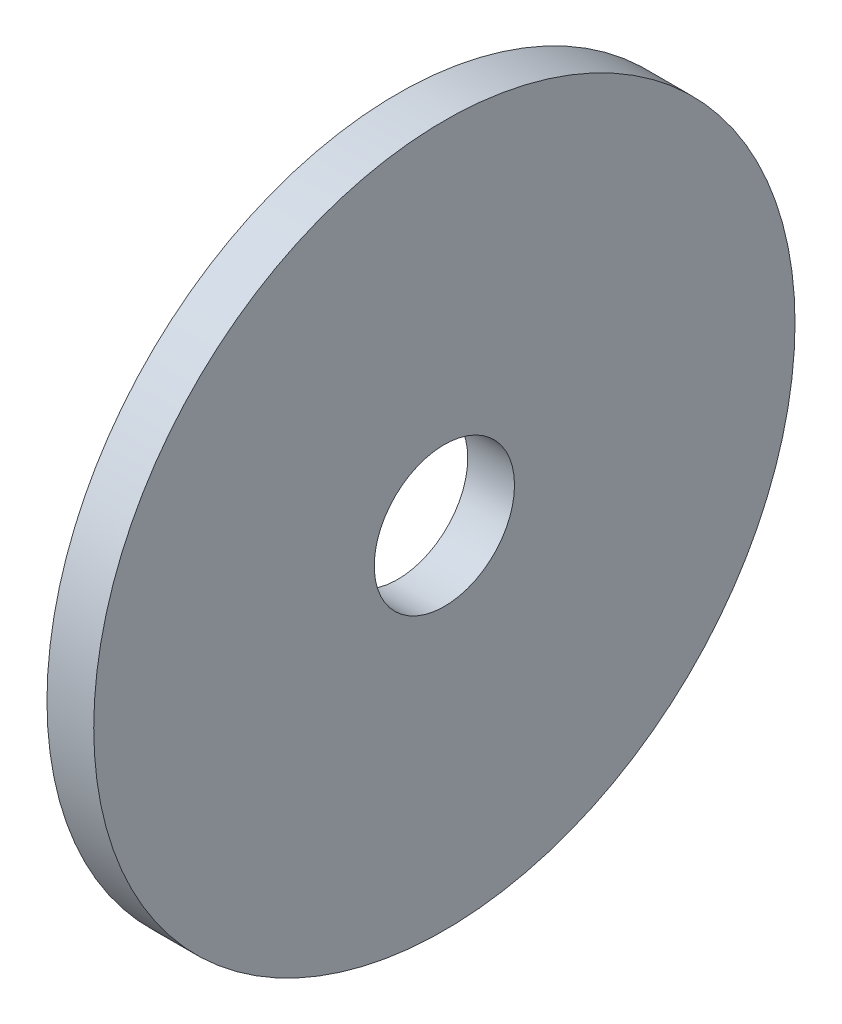
ISO-10303-21;
HEADER;
FILE_DESCRIPTION(('STEP AP214'),'2;1');
FILE_NAME('part.step','',(''),(''),'','','');
FILE_SCHEMA(('AUTOMOTIVE_DESIGN { 1 0 10303 214 1 1 1 1 }'));
ENDSEC;
DATA;
#1=APPLICATION_CONTEXT('core data for automotive mechanical design processes');
#2=APPLICATION_PROTOCOL_DEFINITION('international standard','automotive_design',2000,#1);
#3=PRODUCT_CONTEXT('',#1,'mechanical');
#4=PRODUCT('Part','Part','',(#3));
#5=PRODUCT_RELATED_PRODUCT_CATEGORY('part','',(#4));
#6=PRODUCT_DEFINITION_FORMATION('','',#4);
#7=PRODUCT_DEFINITION_CONTEXT('part definition',#1,'design');
#8=PRODUCT_DEFINITION('design','',#6,#7);
#9=PRODUCT_DEFINITION_SHAPE('','',#8);
#10=(LENGTH_UNIT() NAMED_UNIT(*) SI_UNIT(.MILLI.,.METRE.));
#11=(NAMED_UNIT(*) PLANE_ANGLE_UNIT() SI_UNIT($,.RADIAN.));
#12=(NAMED_UNIT(*) SI_UNIT($,.STERADIAN.) SOLID_ANGLE_UNIT());
#13=UNCERTAINTY_MEASURE_WITH_UNIT(LENGTH_MEASURE(1.E-05),#10,'distance_accuracy_value','');
#14=(GEOMETRIC_REPRESENTATION_CONTEXT(3) GLOBAL_UNCERTAINTY_ASSIGNED_CONTEXT((#13)) GLOBAL_UNIT_ASSIGNED_CONTEXT((#10,
#11,#12)) REPRESENTATION_CONTEXT('',''));
#15=CARTESIAN_POINT('',(0.,0.,0.));
#16=DIRECTION('',(0.,0.,1.));
#17=DIRECTION('',(1.,0.,0.));
#18=AXIS2_PLACEMENT_3D('',#15,#16,#17);
#19=CARTESIAN_POINT('',(2.,0.,0.));
#20=DIRECTION('',(1.,0.,0.));
#21=DIRECTION('',(0.,0.,-1.));
#22=AXIS2_PLACEMENT_3D('',#19,#20,#21);
#23=PLANE('',#22);
#24=CARTESIAN_POINT('',(2.,0.,0.));
#25=DIRECTION('',(1.,0.,0.));
#26=DIRECTION('',(0.,0.,-1.));
#27=AXIS2_PLACEMENT_3D('',#24,#25,#26);
#28=CIRCLE('',#27,30.);
#29=CARTESIAN_POINT('',(2.,0.,-30.));
#30=VERTEX_POINT('',#29);
#31=EDGE_CURVE('E10',#30,#30,#28,.T.);
#32=ORIENTED_EDGE('',*,*,#31,.T.);
#33=EDGE_LOOP('',(#32));
#34=FACE_BOUND('',#33,.T.);
#35=CARTESIAN_POINT('',(2.,0.,0.));
#36=DIRECTION('',(1.,0.,0.));
#37=DIRECTION('',(0.,0.,-1.));
#38=AXIS2_PLACEMENT_3D('',#35,#36,#37);
#39=CIRCLE('',#38,6.);
#40=CARTESIAN_POINT('',(2.,0.,-6.));
#41=VERTEX_POINT('',#40);
#42=EDGE_CURVE('E41',#41,#41,#39,.T.);
#43=ORIENTED_EDGE('',*,*,#42,.F.);
#44=EDGE_LOOP('',(#43));
#45=FACE_BOUND('',#44,.T.);
#46=ADVANCED_FACE('F30',(#34,#45),#23,.T.);
#47=CARTESIAN_POINT('',(-2.,0.,0.));
#48=DIRECTION('',(1.,0.,0.));
#49=DIRECTION('',(0.,0.,-1.));
#50=AXIS2_PLACEMENT_3D('',#47,#48,#49);
#51=PLANE('',#50);
#52=CARTESIAN_POINT('',(-2.,0.,0.));
#53=DIRECTION('',(1.,0.,0.));
#54=DIRECTION('',(0.,0.,-1.));
#55=AXIS2_PLACEMENT_3D('',#52,#53,#54);
#56=CIRCLE('',#55,30.);
#57=CARTESIAN_POINT('',(-2.,0.,-30.));
#58=VERTEX_POINT('',#57);
#59=EDGE_CURVE('E34',#58,#58,#56,.T.);
#60=ORIENTED_EDGE('',*,*,#59,.F.);
#61=EDGE_LOOP('',(#60));
#62=FACE_BOUND('',#61,.T.);
#63=CARTESIAN_POINT('',(-2.,0.,0.));
#64=DIRECTION('',(1.,0.,0.));
#65=DIRECTION('',(0.,0.,-1.));
#66=AXIS2_PLACEMENT_3D('',#63,#64,#65);
#67=CIRCLE('',#66,6.);
#68=CARTESIAN_POINT('',(-2.,0.,-6.));
#69=VERTEX_POINT('',#68);
#70=EDGE_CURVE('E43',#69,#69,#67,.T.);
#71=ORIENTED_EDGE('',*,*,#70,.T.);
#72=EDGE_LOOP('',(#71));
#73=FACE_BOUND('',#72,.T.);
#74=ADVANCED_FACE('F53',(#62,#73),#51,.F.);
#75=CARTESIAN_POINT('',(2.,0.,0.));
#76=DIRECTION('',(-1.,0.,0.));
#77=DIRECTION('',(0.,0.,1.));
#78=AXIS2_PLACEMENT_3D('',#75,#76,#77);
#79=CYLINDRICAL_SURFACE('',#78,30.);
#80=ORIENTED_EDGE('',*,*,#31,.F.);
#81=EDGE_LOOP('',(#80));
#82=FACE_BOUND('',#81,.T.);
#83=ORIENTED_EDGE('',*,*,#59,.T.);
#84=EDGE_LOOP('',(#83));
#85=FACE_BOUND('',#84,.T.);
#86=ADVANCED_FACE('F32',(#82,#85),#79,.T.);
#87=CARTESIAN_POINT('',(2.,0.,0.));
#88=DIRECTION('',(-1.,0.,0.));
#89=DIRECTION('',(0.,0.,1.));
#90=AXIS2_PLACEMENT_3D('',#87,#88,#89);
#91=CYLINDRICAL_SURFACE('',#90,6.);
#92=ORIENTED_EDGE('',*,*,#42,.T.);
#93=EDGE_LOOP('',(#92));
#94=FACE_BOUND('',#93,.T.);
#95=ORIENTED_EDGE('',*,*,#70,.F.);
#96=EDGE_LOOP('',(#95));
#97=FACE_BOUND('',#96,.T.);
#98=ADVANCED_FACE('F49',(#94,#97),#91,.F.);
#99=CLOSED_SHELL('',(#46,#74,#86,#98));
#100=MANIFOLD_SOLID_BREP('B2',#99);
#101=ADVANCED_BREP_SHAPE_REPRESENTATION('',(#18,#100),#14);
#102=SHAPE_DEFINITION_REPRESENTATION(#9,#101);
ENDSEC;
END-ISO-10303-21;
